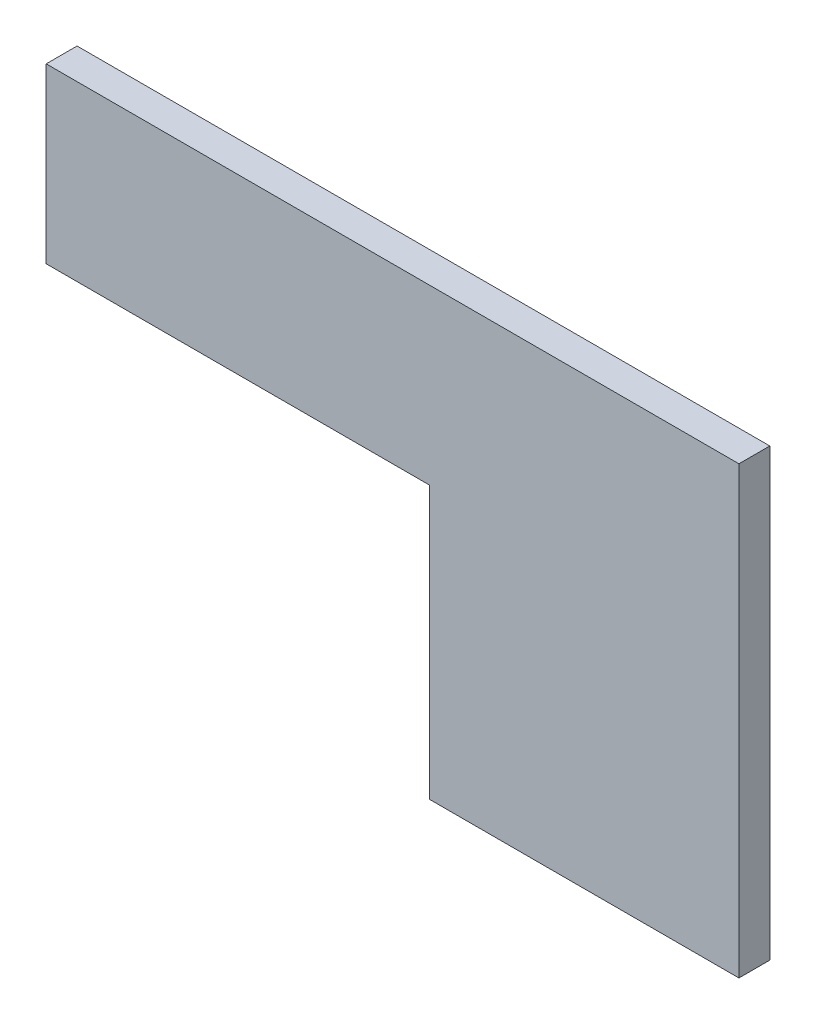
ISO-10303-21;
HEADER;
FILE_DESCRIPTION(('STEP AP214'),'2;1');
FILE_NAME('part.step','',(''),(''),'','','');
FILE_SCHEMA(('AUTOMOTIVE_DESIGN { 1 0 10303 214 1 1 1 1 }'));
ENDSEC;
DATA;
#1=APPLICATION_CONTEXT('core data for automotive mechanical design processes');
#2=APPLICATION_PROTOCOL_DEFINITION('international standard','automotive_design',2000,#1);
#3=PRODUCT_CONTEXT('',#1,'mechanical');
#4=PRODUCT('Part','Part','',(#3));
#5=PRODUCT_RELATED_PRODUCT_CATEGORY('part','',(#4));
#6=PRODUCT_DEFINITION_FORMATION('','',#4);
#7=PRODUCT_DEFINITION_CONTEXT('part definition',#1,'design');
#8=PRODUCT_DEFINITION('design','',#6,#7);
#9=PRODUCT_DEFINITION_SHAPE('','',#8);
#10=(LENGTH_UNIT() NAMED_UNIT(*) SI_UNIT(.MILLI.,.METRE.));
#11=(NAMED_UNIT(*) PLANE_ANGLE_UNIT() SI_UNIT($,.RADIAN.));
#12=(NAMED_UNIT(*) SI_UNIT($,.STERADIAN.) SOLID_ANGLE_UNIT());
#13=UNCERTAINTY_MEASURE_WITH_UNIT(LENGTH_MEASURE(1.E-05),#10,'distance_accuracy_value','');
#14=(GEOMETRIC_REPRESENTATION_CONTEXT(3) GLOBAL_UNCERTAINTY_ASSIGNED_CONTEXT((#13)) GLOBAL_UNIT_ASSIGNED_CONTEXT((#10,
#11,#12)) REPRESENTATION_CONTEXT('',''));
#15=CARTESIAN_POINT('',(0.,0.,0.));
#16=DIRECTION('',(0.,0.,1.));
#17=DIRECTION('',(1.,0.,0.));
#18=AXIS2_PLACEMENT_3D('',#15,#16,#17);
#19=CARTESIAN_POINT('',(0.,0.,7.9248));
#20=DIRECTION('',(1.,0.,0.));
#21=DIRECTION('',(0.,0.,-1.));
#22=AXIS2_PLACEMENT_3D('',#19,#20,#21);
#23=PLANE('',#22);
#24=DIRECTION('',(0.,0.,-1.));
#25=VECTOR('',#24,1.);
#26=CARTESIAN_POINT('',(0.,69.85,7.9248));
#27=LINE('',#26,#25);
#28=CARTESIAN_POINT('',(0.,69.85,7.9248));
#29=VERTEX_POINT('',#28);
#30=CARTESIAN_POINT('',(0.,69.85,0.));
#31=VERTEX_POINT('',#30);
#32=EDGE_CURVE('E53',#29,#31,#27,.T.);
#33=ORIENTED_EDGE('',*,*,#32,.F.);
#34=DIRECTION('',(0.,-1.,0.));
#35=VECTOR('',#34,1.);
#36=CARTESIAN_POINT('',(0.,0.,7.9248));
#37=LINE('',#36,#35);
#38=CARTESIAN_POINT('',(0.,114.3,7.9248));
#39=VERTEX_POINT('',#38);
#40=EDGE_CURVE('E120',#39,#29,#37,.T.);
#41=ORIENTED_EDGE('',*,*,#40,.F.);
#42=DIRECTION('',(0.,0.,-1.));
#43=VECTOR('',#42,1.);
#44=CARTESIAN_POINT('',(0.,114.3,7.9248));
#45=LINE('',#44,#43);
#46=CARTESIAN_POINT('',(0.,114.3,0.));
#47=VERTEX_POINT('',#46);
#48=EDGE_CURVE('E126',#39,#47,#45,.T.);
#49=ORIENTED_EDGE('',*,*,#48,.T.);
#50=DIRECTION('',(0.,-1.,0.));
#51=VECTOR('',#50,1.);
#52=CARTESIAN_POINT('',(0.,0.,0.));
#53=LINE('',#52,#51);
#54=EDGE_CURVE('E109',#47,#31,#53,.T.);
#55=ORIENTED_EDGE('',*,*,#54,.T.);
#56=EDGE_LOOP('',(#33,#41,#49,#55));
#57=FACE_BOUND('',#56,.T.);
#58=ADVANCED_FACE('F39',(#57),#23,.F.);
#59=CARTESIAN_POINT('',(0.,0.,7.9248));
#60=DIRECTION('',(0.,1.,0.));
#61=DIRECTION('',(0.,0.,1.));
#62=AXIS2_PLACEMENT_3D('',#59,#60,#61);
#63=PLANE('',#62);
#64=DIRECTION('',(0.,0.,-1.));
#65=VECTOR('',#64,1.);
#66=CARTESIAN_POINT('',(98.425,0.,7.9248));
#67=LINE('',#66,#65);
#68=CARTESIAN_POINT('',(98.425,0.,7.9248));
#69=VERTEX_POINT('',#68);
#70=CARTESIAN_POINT('',(98.425,0.,0.));
#71=VERTEX_POINT('',#70);
#72=EDGE_CURVE('E101',#69,#71,#67,.T.);
#73=ORIENTED_EDGE('',*,*,#72,.T.);
#74=DIRECTION('',(1.,0.,0.));
#75=VECTOR('',#74,1.);
#76=CARTESIAN_POINT('',(0.,0.,0.));
#77=LINE('',#76,#75);
#78=CARTESIAN_POINT('',(177.8,0.,0.));
#79=VERTEX_POINT('',#78);
#80=EDGE_CURVE('E129',#71,#79,#77,.T.);
#81=ORIENTED_EDGE('',*,*,#80,.T.);
#82=DIRECTION('',(0.,0.,-1.));
#83=VECTOR('',#82,1.);
#84=CARTESIAN_POINT('',(177.8,0.,7.9248));
#85=LINE('',#84,#83);
#86=CARTESIAN_POINT('',(177.8,0.,7.9248));
#87=VERTEX_POINT('',#86);
#88=EDGE_CURVE('E11',#87,#79,#85,.T.);
#89=ORIENTED_EDGE('',*,*,#88,.F.);
#90=DIRECTION('',(1.,0.,0.));
#91=VECTOR('',#90,1.);
#92=CARTESIAN_POINT('',(0.,0.,7.9248));
#93=LINE('',#92,#91);
#94=EDGE_CURVE('E84',#69,#87,#93,.T.);
#95=ORIENTED_EDGE('',*,*,#94,.F.);
#96=EDGE_LOOP('',(#73,#81,#89,#95));
#97=FACE_BOUND('',#96,.T.);
#98=ADVANCED_FACE('F117',(#97),#63,.F.);
#99=CARTESIAN_POINT('',(0.,0.,7.9248));
#100=DIRECTION('',(0.,0.,-1.));
#101=DIRECTION('',(-1.,0.,0.));
#102=AXIS2_PLACEMENT_3D('',#99,#100,#101);
#103=PLANE('',#102);
#104=DIRECTION('',(0.,1.,0.));
#105=VECTOR('',#104,1.);
#106=CARTESIAN_POINT('',(98.425,0.,7.9248));
#107=LINE('',#106,#105);
#108=CARTESIAN_POINT('',(98.425,69.85,7.9248));
#109=VERTEX_POINT('',#108);
#110=EDGE_CURVE('E103',#69,#109,#107,.T.);
#111=ORIENTED_EDGE('',*,*,#110,.F.);
#112=ORIENTED_EDGE('',*,*,#94,.T.);
#113=DIRECTION('',(0.,1.,0.));
#114=VECTOR('',#113,1.);
#115=CARTESIAN_POINT('',(177.8,0.,7.9248));
#116=LINE('',#115,#114);
#117=CARTESIAN_POINT('',(177.8,114.3,7.9248));
#118=VERTEX_POINT('',#117);
#119=EDGE_CURVE('E119',#87,#118,#116,.T.);
#120=ORIENTED_EDGE('',*,*,#119,.T.);
#121=DIRECTION('',(-1.,0.,0.));
#122=VECTOR('',#121,1.);
#123=CARTESIAN_POINT('',(0.,114.3,7.9248));
#124=LINE('',#123,#122);
#125=EDGE_CURVE('E62',#118,#39,#124,.T.);
#126=ORIENTED_EDGE('',*,*,#125,.T.);
#127=ORIENTED_EDGE('',*,*,#40,.T.);
#128=DIRECTION('',(-1.,0.,0.));
#129=VECTOR('',#128,1.);
#130=CARTESIAN_POINT('',(0.,69.85,7.9248));
#131=LINE('',#130,#129);
#132=EDGE_CURVE('E114',#109,#29,#131,.T.);
#133=ORIENTED_EDGE('',*,*,#132,.F.);
#134=EDGE_LOOP('',(#111,#112,#120,#126,#127,#133));
#135=FACE_BOUND('',#134,.T.);
#136=ADVANCED_FACE('F113',(#135),#103,.F.);
#137=CARTESIAN_POINT('',(0.,0.,0.));
#138=DIRECTION('',(0.,0.,-1.));
#139=DIRECTION('',(-1.,0.,0.));
#140=AXIS2_PLACEMENT_3D('',#137,#138,#139);
#141=PLANE('',#140);
#142=ORIENTED_EDGE('',*,*,#80,.F.);
#143=DIRECTION('',(0.,1.,0.));
#144=VECTOR('',#143,1.);
#145=CARTESIAN_POINT('',(98.425,0.,0.));
#146=LINE('',#145,#144);
#147=CARTESIAN_POINT('',(98.425,69.85,0.));
#148=VERTEX_POINT('',#147);
#149=EDGE_CURVE('E106',#71,#148,#146,.T.);
#150=ORIENTED_EDGE('',*,*,#149,.T.);
#151=DIRECTION('',(-1.,0.,0.));
#152=VECTOR('',#151,1.);
#153=CARTESIAN_POINT('',(0.,69.85,0.));
#154=LINE('',#153,#152);
#155=EDGE_CURVE('E115',#148,#31,#154,.T.);
#156=ORIENTED_EDGE('',*,*,#155,.T.);
#157=ORIENTED_EDGE('',*,*,#54,.F.);
#158=DIRECTION('',(-1.,0.,0.));
#159=VECTOR('',#158,1.);
#160=CARTESIAN_POINT('',(0.,114.3,0.));
#161=LINE('',#160,#159);
#162=CARTESIAN_POINT('',(177.8,114.3,0.));
#163=VERTEX_POINT('',#162);
#164=EDGE_CURVE('E79',#163,#47,#161,.T.);
#165=ORIENTED_EDGE('',*,*,#164,.F.);
#166=DIRECTION('',(0.,1.,0.));
#167=VECTOR('',#166,1.);
#168=CARTESIAN_POINT('',(177.8,0.,0.));
#169=LINE('',#168,#167);
#170=EDGE_CURVE('E131',#79,#163,#169,.T.);
#171=ORIENTED_EDGE('',*,*,#170,.F.);
#172=EDGE_LOOP('',(#142,#150,#156,#157,#165,#171));
#173=FACE_BOUND('',#172,.T.);
#174=ADVANCED_FACE('F140',(#173),#141,.T.);
#175=CARTESIAN_POINT('',(177.8,0.,7.9248));
#176=DIRECTION('',(-1.,0.,0.));
#177=DIRECTION('',(0.,0.,1.));
#178=AXIS2_PLACEMENT_3D('',#175,#176,#177);
#179=PLANE('',#178);
#180=ORIENTED_EDGE('',*,*,#170,.T.);
#181=DIRECTION('',(0.,0.,-1.));
#182=VECTOR('',#181,1.);
#183=CARTESIAN_POINT('',(177.8,114.3,7.9248));
#184=LINE('',#183,#182);
#185=EDGE_CURVE('E46',#118,#163,#184,.T.);
#186=ORIENTED_EDGE('',*,*,#185,.F.);
#187=ORIENTED_EDGE('',*,*,#119,.F.);
#188=ORIENTED_EDGE('',*,*,#88,.T.);
#189=EDGE_LOOP('',(#180,#186,#187,#188));
#190=FACE_BOUND('',#189,.T.);
#191=ADVANCED_FACE('F148',(#190),#179,.F.);
#192=CARTESIAN_POINT('',(0.,114.3,7.9248));
#193=DIRECTION('',(0.,-1.,0.));
#194=DIRECTION('',(0.,0.,-1.));
#195=AXIS2_PLACEMENT_3D('',#192,#193,#194);
#196=PLANE('',#195);
#197=ORIENTED_EDGE('',*,*,#164,.T.);
#198=ORIENTED_EDGE('',*,*,#48,.F.);
#199=ORIENTED_EDGE('',*,*,#125,.F.);
#200=ORIENTED_EDGE('',*,*,#185,.T.);
#201=EDGE_LOOP('',(#197,#198,#199,#200));
#202=FACE_BOUND('',#201,.T.);
#203=ADVANCED_FACE('F135',(#202),#196,.F.);
#204=CARTESIAN_POINT('',(98.425,0.,7.9248));
#205=DIRECTION('',(-1.,0.,0.));
#206=DIRECTION('',(0.,0.,1.));
#207=AXIS2_PLACEMENT_3D('',#204,#205,#206);
#208=PLANE('',#207);
#209=ORIENTED_EDGE('',*,*,#149,.F.);
#210=ORIENTED_EDGE('',*,*,#72,.F.);
#211=ORIENTED_EDGE('',*,*,#110,.T.);
#212=DIRECTION('',(0.,0.,-1.));
#213=VECTOR('',#212,1.);
#214=CARTESIAN_POINT('',(98.425,69.85,7.9248));
#215=LINE('',#214,#213);
#216=EDGE_CURVE('E110',#109,#148,#215,.T.);
#217=ORIENTED_EDGE('',*,*,#216,.T.);
#218=EDGE_LOOP('',(#209,#210,#211,#217));
#219=FACE_BOUND('',#218,.T.);
#220=ADVANCED_FACE('F102',(#219),#208,.T.);
#221=CARTESIAN_POINT('',(0.,69.85,7.9248));
#222=DIRECTION('',(0.,-1.,0.));
#223=DIRECTION('',(0.,0.,-1.));
#224=AXIS2_PLACEMENT_3D('',#221,#222,#223);
#225=PLANE('',#224);
#226=ORIENTED_EDGE('',*,*,#155,.F.);
#227=ORIENTED_EDGE('',*,*,#216,.F.);
#228=ORIENTED_EDGE('',*,*,#132,.T.);
#229=ORIENTED_EDGE('',*,*,#32,.T.);
#230=EDGE_LOOP('',(#226,#227,#228,#229));
#231=FACE_BOUND('',#230,.T.);
#232=ADVANCED_FACE('F170',(#231),#225,.T.);
#233=CLOSED_SHELL('',(#58,#98,#136,#174,#191,#203,#220,#232));
#234=MANIFOLD_SOLID_BREP('B2',#233);
#235=ADVANCED_BREP_SHAPE_REPRESENTATION('',(#18,#234),#14);
#236=SHAPE_DEFINITION_REPRESENTATION(#9,#235);
ENDSEC;
END-ISO-10303-21;
